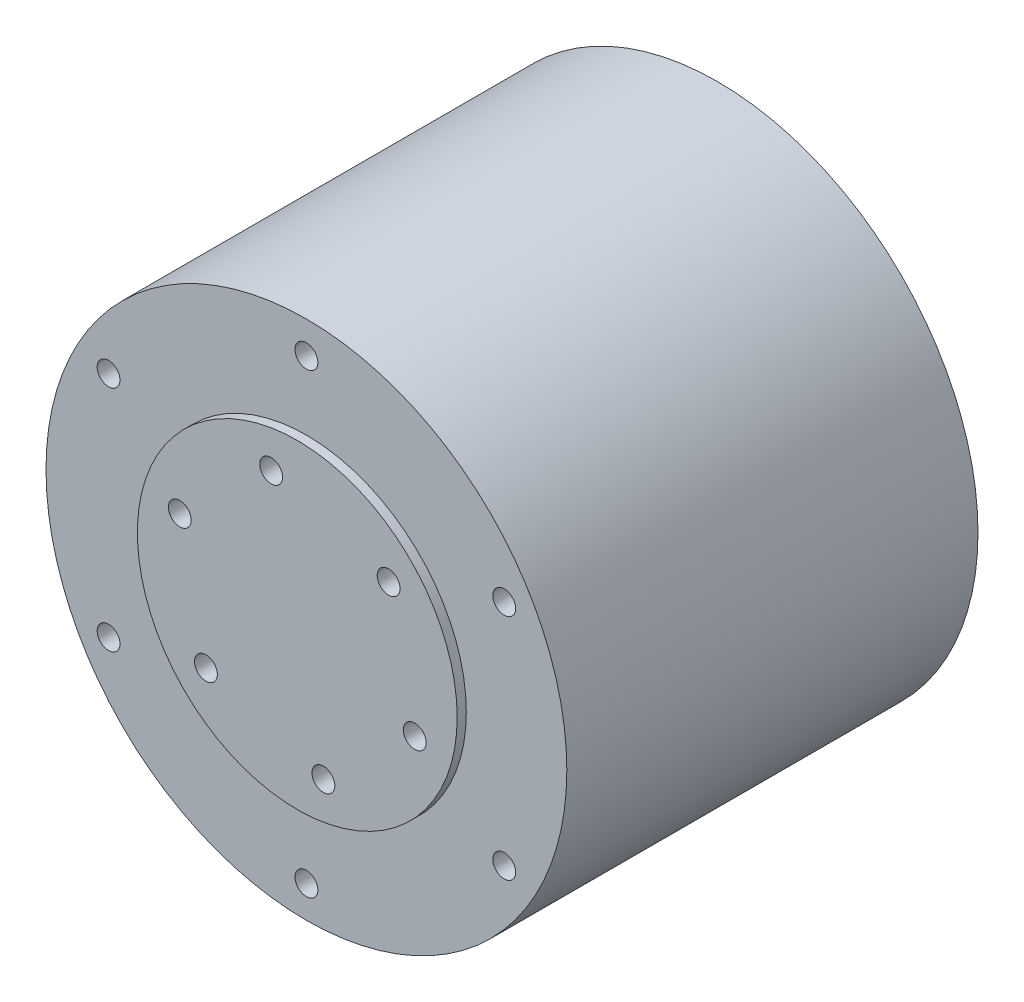
ISO-10303-21;
HEADER;
FILE_DESCRIPTION(('STEP AP214'),'2;1');
FILE_NAME('part.step','',(''),(''),'','','');
FILE_SCHEMA(('AUTOMOTIVE_DESIGN { 1 0 10303 214 1 1 1 1 }'));
ENDSEC;
DATA;
#1=APPLICATION_CONTEXT('core data for automotive mechanical design processes');
#2=APPLICATION_PROTOCOL_DEFINITION('international standard','automotive_design',2000,#1);
#3=PRODUCT_CONTEXT('',#1,'mechanical');
#4=PRODUCT('Part','Part','',(#3));
#5=PRODUCT_RELATED_PRODUCT_CATEGORY('part','',(#4));
#6=PRODUCT_DEFINITION_FORMATION('','',#4);
#7=PRODUCT_DEFINITION_CONTEXT('part definition',#1,'design');
#8=PRODUCT_DEFINITION('design','',#6,#7);
#9=PRODUCT_DEFINITION_SHAPE('','',#8);
#10=(LENGTH_UNIT() NAMED_UNIT(*) SI_UNIT(.MILLI.,.METRE.));
#11=(NAMED_UNIT(*) PLANE_ANGLE_UNIT() SI_UNIT($,.RADIAN.));
#12=(NAMED_UNIT(*) SI_UNIT($,.STERADIAN.) SOLID_ANGLE_UNIT());
#13=UNCERTAINTY_MEASURE_WITH_UNIT(LENGTH_MEASURE(1.E-05),#10,'distance_accuracy_value','');
#14=(GEOMETRIC_REPRESENTATION_CONTEXT(3) GLOBAL_UNCERTAINTY_ASSIGNED_CONTEXT((#13)) GLOBAL_UNIT_ASSIGNED_CONTEXT((#10,
#11,#12)) REPRESENTATION_CONTEXT('',''));
#15=CARTESIAN_POINT('',(0.,0.,0.));
#16=DIRECTION('',(0.,0.,1.));
#17=DIRECTION('',(1.,0.,0.));
#18=AXIS2_PLACEMENT_3D('',#15,#16,#17);
#19=CARTESIAN_POINT('',(0.,0.,45.));
#20=DIRECTION('',(0.,0.,-1.));
#21=DIRECTION('',(-1.,0.,0.));
#22=AXIS2_PLACEMENT_3D('',#19,#20,#21);
#23=CYLINDRICAL_SURFACE('',#22,28.5);
#24=CARTESIAN_POINT('',(0.,0.,45.));
#25=DIRECTION('',(0.,0.,1.));
#26=DIRECTION('',(1.,0.,0.));
#27=AXIS2_PLACEMENT_3D('',#24,#25,#26);
#28=CIRCLE('',#27,28.5);
#29=CARTESIAN_POINT('',(-28.5,0.,45.));
#30=VERTEX_POINT('',#29);
#31=EDGE_CURVE('E53',#30,#30,#28,.T.);
#32=CARTESIAN_POINT('',(0.,0.,0.));
#33=DIRECTION('',(0.,0.,1.));
#34=DIRECTION('',(1.,0.,0.));
#35=AXIS2_PLACEMENT_3D('',#32,#33,#34);
#36=CIRCLE('',#35,28.5);
#37=CARTESIAN_POINT('',(-28.5,0.,0.));
#38=VERTEX_POINT('',#37);
#39=EDGE_CURVE('E48',#38,#38,#36,.T.);
#40=CARTESIAN_POINT('',(-28.5,0.,45.));
#41=CARTESIAN_POINT('',(-28.5,0.,44.53125));
#42=CARTESIAN_POINT('',(-28.5,0.,44.0625));
#43=CARTESIAN_POINT('',(-28.5,0.,43.125));
#44=CARTESIAN_POINT('',(-28.5,0.,42.65625));
#45=CARTESIAN_POINT('',(-28.5,0.,41.71875));
#46=CARTESIAN_POINT('',(-28.5,0.,41.25));
#47=CARTESIAN_POINT('',(-28.5,0.,40.3125));
#48=CARTESIAN_POINT('',(-28.5,0.,39.84375));
#49=CARTESIAN_POINT('',(-28.5,0.,38.90625));
#50=CARTESIAN_POINT('',(-28.5,0.,38.4375));
#51=CARTESIAN_POINT('',(-28.5,0.,37.5));
#52=CARTESIAN_POINT('',(-28.5,0.,37.03125));
#53=CARTESIAN_POINT('',(-28.5,0.,36.09375));
#54=CARTESIAN_POINT('',(-28.5,0.,35.625));
#55=CARTESIAN_POINT('',(-28.5,0.,34.6875));
#56=CARTESIAN_POINT('',(-28.5,0.,34.21875));
#57=CARTESIAN_POINT('',(-28.5,0.,33.28125));
#58=CARTESIAN_POINT('',(-28.5,0.,32.8125));
#59=CARTESIAN_POINT('',(-28.5,0.,31.875));
#60=CARTESIAN_POINT('',(-28.5,0.,31.40625));
#61=CARTESIAN_POINT('',(-28.5,0.,30.46875));
#62=CARTESIAN_POINT('',(-28.5,0.,30.));
#63=CARTESIAN_POINT('',(-28.5,0.,29.0625));
#64=CARTESIAN_POINT('',(-28.5,0.,28.59375));
#65=CARTESIAN_POINT('',(-28.5,0.,27.65625));
#66=CARTESIAN_POINT('',(-28.5,0.,27.1875));
#67=CARTESIAN_POINT('',(-28.5,0.,26.25));
#68=CARTESIAN_POINT('',(-28.5,0.,25.78125));
#69=CARTESIAN_POINT('',(-28.5,0.,24.84375));
#70=CARTESIAN_POINT('',(-28.5,0.,24.375));
#71=CARTESIAN_POINT('',(-28.5,0.,23.4375));
#72=CARTESIAN_POINT('',(-28.5,0.,22.96875));
#73=CARTESIAN_POINT('',(-28.5,0.,22.03125));
#74=CARTESIAN_POINT('',(-28.5,0.,21.5625));
#75=CARTESIAN_POINT('',(-28.5,0.,20.625));
#76=CARTESIAN_POINT('',(-28.5,0.,20.15625));
#77=CARTESIAN_POINT('',(-28.5,0.,19.21875));
#78=CARTESIAN_POINT('',(-28.5,0.,18.75));
#79=CARTESIAN_POINT('',(-28.5,0.,17.8125));
#80=CARTESIAN_POINT('',(-28.5,0.,17.34375));
#81=CARTESIAN_POINT('',(-28.5,0.,16.40625));
#82=CARTESIAN_POINT('',(-28.5,0.,15.9375));
#83=CARTESIAN_POINT('',(-28.5,0.,15.));
#84=CARTESIAN_POINT('',(-28.5,0.,14.53125));
#85=CARTESIAN_POINT('',(-28.5,0.,13.59375));
#86=CARTESIAN_POINT('',(-28.5,0.,13.125));
#87=CARTESIAN_POINT('',(-28.5,0.,12.1875));
#88=CARTESIAN_POINT('',(-28.5,0.,11.71875));
#89=CARTESIAN_POINT('',(-28.5,0.,10.78125));
#90=CARTESIAN_POINT('',(-28.5,0.,10.3125));
#91=CARTESIAN_POINT('',(-28.5,0.,9.375));
#92=CARTESIAN_POINT('',(-28.5,0.,8.90625));
#93=CARTESIAN_POINT('',(-28.5,0.,7.96874999999999));
#94=CARTESIAN_POINT('',(-28.5,0.,7.5));
#95=CARTESIAN_POINT('',(-28.5,0.,6.5625));
#96=CARTESIAN_POINT('',(-28.5,0.,6.09375));
#97=CARTESIAN_POINT('',(-28.5,0.,5.15625));
#98=CARTESIAN_POINT('',(-28.5,0.,4.68749999999999));
#99=CARTESIAN_POINT('',(-28.5,0.,3.74999999999999));
#100=CARTESIAN_POINT('',(-28.5,0.,3.28124999999999));
#101=CARTESIAN_POINT('',(-28.5,0.,2.34374999999999));
#102=CARTESIAN_POINT('',(-28.5,0.,1.87499999999999));
#103=CARTESIAN_POINT('',(-28.5,0.,0.937499999999992));
#104=CARTESIAN_POINT('',(-28.5,0.,0.468749999999993));
#105=CARTESIAN_POINT('',(-28.5,0.,0.));
#106=B_SPLINE_CURVE_WITH_KNOTS('',3,(#40,#41,#42,#43,#44,#45,#46,#47,#48,#49,#50,#51,#52,#53,
#54,#55,#56,#57,#58,#59,#60,#61,#62,#63,#64,#65,#66,#67,#68,#69,#70,#71,#72,#73,#74,#75,#76,#77,
#78,#79,#80,#81,#82,#83,#84,#85,#86,#87,#88,#89,#90,#91,#92,#93,#94,#95,#96,#97,#98,#99,#100,
#101,#102,#103,#104,#105),.UNSPECIFIED.,.F.,.F.,(4,2,2,2,2,2,2,2,2,2,2,2,2,2,2,2,2,2,2,2,2,2,2,
2,2,2,2,2,2,2,2,2,4),(0.,1.40625,2.8125,4.21875000000001,5.62500000000001,7.03125,8.4375,
9.84375000000001,11.25,12.65625,14.0625,15.46875,16.875,18.28125,19.6875,21.09375,22.5,23.90625,
25.3125,26.71875,28.125,29.53125,30.9375,32.34375,33.75,35.15625,36.5625,37.96875,39.375,
40.78125,42.1875,43.59375,45.),.UNSPECIFIED.);
#107=EDGE_CURVE('BSEAM45',#30,#38,#106,.T.);
#108=ORIENTED_EDGE('',*,*,#31,.F.);
#109=ORIENTED_EDGE('',*,*,#39,.T.);
#110=ORIENTED_EDGE('',*,*,#107,.T.);
#111=ORIENTED_EDGE('',*,*,#107,.F.);
#112=EDGE_LOOP('',(#108,#110,#109,#111));
#113=FACE_BOUND('',#112,.T.);
#114=ADVANCED_FACE('F45',(#113),#23,.T.);
#115=CARTESIAN_POINT('',(0.,0.,45.));
#116=DIRECTION('',(0.,0.,1.));
#117=DIRECTION('',(1.,0.,0.));
#118=AXIS2_PLACEMENT_3D('',#115,#116,#117);
#119=PLANE('',#118);
#120=CARTESIAN_POINT('',(0.,25.,45.));
#121=DIRECTION('',(0.,0.,1.));
#122=DIRECTION('',(1.,0.,0.));
#123=AXIS2_PLACEMENT_3D('',#120,#121,#122);
#124=CIRCLE('',#123,1.25);
#125=CARTESIAN_POINT('',(1.25,25.,45.));
#126=VERTEX_POINT('',#125);
#127=EDGE_CURVE('E172',#126,#126,#124,.T.);
#128=ORIENTED_EDGE('',*,*,#127,.F.);
#129=EDGE_LOOP('',(#128));
#130=FACE_BOUND('',#129,.T.);
#131=CARTESIAN_POINT('',(21.650635094611,12.5,45.));
#132=DIRECTION('',(0.,0.,1.));
#133=DIRECTION('',(1.,0.,0.));
#134=AXIS2_PLACEMENT_3D('',#131,#132,#133);
#135=CIRCLE('',#134,1.25);
#136=CARTESIAN_POINT('',(22.900635094611,12.5,45.));
#137=VERTEX_POINT('',#136);
#138=EDGE_CURVE('E178',#137,#137,#135,.T.);
#139=ORIENTED_EDGE('',*,*,#138,.F.);
#140=EDGE_LOOP('',(#139));
#141=FACE_BOUND('',#140,.T.);
#142=CARTESIAN_POINT('',(21.650635094611,-12.5,45.));
#143=DIRECTION('',(0.,0.,1.));
#144=DIRECTION('',(1.,0.,0.));
#145=AXIS2_PLACEMENT_3D('',#142,#143,#144);
#146=CIRCLE('',#145,1.25);
#147=CARTESIAN_POINT('',(22.900635094611,-12.5,45.));
#148=VERTEX_POINT('',#147);
#149=EDGE_CURVE('E184',#148,#148,#146,.T.);
#150=ORIENTED_EDGE('',*,*,#149,.F.);
#151=EDGE_LOOP('',(#150));
#152=FACE_BOUND('',#151,.T.);
#153=CARTESIAN_POINT('',(0.,-25.,45.));
#154=DIRECTION('',(0.,0.,1.));
#155=DIRECTION('',(1.,0.,0.));
#156=AXIS2_PLACEMENT_3D('',#153,#154,#155);
#157=CIRCLE('',#156,1.25);
#158=CARTESIAN_POINT('',(1.25,-25.,45.));
#159=VERTEX_POINT('',#158);
#160=EDGE_CURVE('E190',#159,#159,#157,.T.);
#161=ORIENTED_EDGE('',*,*,#160,.F.);
#162=EDGE_LOOP('',(#161));
#163=FACE_BOUND('',#162,.T.);
#164=CARTESIAN_POINT('',(-21.650635094611,-12.5,45.));
#165=DIRECTION('',(0.,0.,1.));
#166=DIRECTION('',(1.,0.,0.));
#167=AXIS2_PLACEMENT_3D('',#164,#165,#166);
#168=CIRCLE('',#167,1.25);
#169=CARTESIAN_POINT('',(-20.400635094611,-12.5,45.));
#170=VERTEX_POINT('',#169);
#171=EDGE_CURVE('E196',#170,#170,#168,.T.);
#172=ORIENTED_EDGE('',*,*,#171,.F.);
#173=EDGE_LOOP('',(#172));
#174=FACE_BOUND('',#173,.T.);
#175=CARTESIAN_POINT('',(-21.650635094611,12.5,45.));
#176=DIRECTION('',(0.,0.,1.));
#177=DIRECTION('',(1.,0.,0.));
#178=AXIS2_PLACEMENT_3D('',#175,#176,#177);
#179=CIRCLE('',#178,1.25);
#180=CARTESIAN_POINT('',(-20.400635094611,12.5,45.));
#181=VERTEX_POINT('',#180);
#182=EDGE_CURVE('E202',#181,#181,#179,.T.);
#183=ORIENTED_EDGE('',*,*,#182,.F.);
#184=EDGE_LOOP('',(#183));
#185=FACE_BOUND('',#184,.T.);
#186=CARTESIAN_POINT('',(0.,0.,45.));
#187=DIRECTION('',(0.,0.,1.));
#188=DIRECTION('',(1.,0.,0.));
#189=AXIS2_PLACEMENT_3D('',#186,#187,#188);
#190=CIRCLE('',#189,17.5);
#191=CARTESIAN_POINT('',(17.5,0.,45.));
#192=VERTEX_POINT('',#191);
#193=EDGE_CURVE('E11',#192,#192,#190,.T.);
#194=ORIENTED_EDGE('',*,*,#193,.F.);
#195=EDGE_LOOP('',(#194));
#196=FACE_BOUND('',#195,.T.);
#197=ORIENTED_EDGE('',*,*,#31,.T.);
#198=EDGE_LOOP('',(#197));
#199=FACE_BOUND('',#198,.T.);
#200=ADVANCED_FACE('F220',(#130,#141,#152,#163,#174,#185,#196,#199),#119,.T.);
#201=CARTESIAN_POINT('',(0.,0.,0.));
#202=DIRECTION('',(0.,0.,1.));
#203=DIRECTION('',(1.,0.,0.));
#204=AXIS2_PLACEMENT_3D('',#201,#202,#203);
#205=PLANE('',#204);
#206=CARTESIAN_POINT('',(13.4350288425444,13.4350288425444,0.));
#207=DIRECTION('',(0.,0.,-1.));
#208=DIRECTION('',(-1.,0.,0.));
#209=AXIS2_PLACEMENT_3D('',#206,#207,#208);
#210=CIRCLE('',#209,1.24999999999999);
#211=CARTESIAN_POINT('',(12.1850288425444,13.4350288425444,0.));
#212=VERTEX_POINT('',#211);
#213=EDGE_CURVE('E114',#212,#212,#210,.T.);
#214=ORIENTED_EDGE('',*,*,#213,.F.);
#215=EDGE_LOOP('',(#214));
#216=FACE_BOUND('',#215,.T.);
#217=CARTESIAN_POINT('',(13.4350288425443,-13.4350288425442,0.));
#218=DIRECTION('',(0.,0.,-1.));
#219=DIRECTION('',(-1.,0.,0.));
#220=AXIS2_PLACEMENT_3D('',#217,#218,#219);
#221=CIRCLE('',#220,1.24999999999999);
#222=CARTESIAN_POINT('',(12.1850288425444,-13.4350288425442,0.));
#223=VERTEX_POINT('',#222);
#224=EDGE_CURVE('E113',#223,#223,#221,.T.);
#225=ORIENTED_EDGE('',*,*,#224,.F.);
#226=EDGE_LOOP('',(#225));
#227=FACE_BOUND('',#226,.T.);
#228=CARTESIAN_POINT('',(-13.4350288425443,-13.4350288425442,0.));
#229=DIRECTION('',(0.,0.,-1.));
#230=DIRECTION('',(-1.,0.,0.));
#231=AXIS2_PLACEMENT_3D('',#228,#229,#230);
#232=CIRCLE('',#231,1.24999999999999);
#233=CARTESIAN_POINT('',(-14.6850288425443,-13.4350288425442,0.));
#234=VERTEX_POINT('',#233);
#235=EDGE_CURVE('E124',#234,#234,#232,.T.);
#236=ORIENTED_EDGE('',*,*,#235,.F.);
#237=EDGE_LOOP('',(#236));
#238=FACE_BOUND('',#237,.T.);
#239=CARTESIAN_POINT('',(-13.4350288425444,13.4350288425444,0.));
#240=DIRECTION('',(0.,0.,-1.));
#241=DIRECTION('',(-1.,0.,0.));
#242=AXIS2_PLACEMENT_3D('',#239,#240,#241);
#243=CIRCLE('',#242,1.24999999999999);
#244=CARTESIAN_POINT('',(-14.6850288425444,13.4350288425444,0.));
#245=VERTEX_POINT('',#244);
#246=EDGE_CURVE('E130',#245,#245,#243,.T.);
#247=ORIENTED_EDGE('',*,*,#246,.F.);
#248=EDGE_LOOP('',(#247));
#249=FACE_BOUND('',#248,.T.);
#250=ORIENTED_EDGE('',*,*,#39,.F.);
#251=EDGE_LOOP('',(#250));
#252=FACE_BOUND('',#251,.T.);
#253=ADVANCED_FACE('F217',(#216,#227,#238,#249,#252),#205,.F.);
#254=CARTESIAN_POINT('',(0.,0.,46.));
#255=DIRECTION('',(0.,0.,-1.));
#256=DIRECTION('',(-1.,0.,0.));
#257=AXIS2_PLACEMENT_3D('',#254,#255,#256);
#258=CYLINDRICAL_SURFACE('',#257,17.5);
#259=CARTESIAN_POINT('',(0.,0.,46.));
#260=DIRECTION('',(0.,0.,1.));
#261=DIRECTION('',(1.,0.,0.));
#262=AXIS2_PLACEMENT_3D('',#259,#260,#261);
#263=CIRCLE('',#262,17.5);
#264=CARTESIAN_POINT('',(17.5,0.,46.));
#265=VERTEX_POINT('',#264);
#266=EDGE_CURVE('E208',#265,#265,#263,.T.);
#267=ORIENTED_EDGE('',*,*,#266,.F.);
#268=EDGE_LOOP('',(#267));
#269=FACE_BOUND('',#268,.T.);
#270=ORIENTED_EDGE('',*,*,#193,.T.);
#271=EDGE_LOOP('',(#270));
#272=FACE_BOUND('',#271,.T.);
#273=ADVANCED_FACE('F219',(#269,#272),#258,.T.);
#274=CARTESIAN_POINT('',(0.,0.,46.));
#275=DIRECTION('',(0.,0.,1.));
#276=DIRECTION('',(1.,0.,0.));
#277=AXIS2_PLACEMENT_3D('',#274,#275,#276);
#278=PLANE('',#277);
#279=CARTESIAN_POINT('',(-2.85768239704188,13.194076372283,46.));
#280=DIRECTION('',(0.,0.,1.));
#281=DIRECTION('',(1.,0.,0.));
#282=AXIS2_PLACEMENT_3D('',#279,#280,#281);
#283=CIRCLE('',#282,1.24999999999999);
#284=CARTESIAN_POINT('',(-1.60768239704189,13.194076372283,46.));
#285=VERTEX_POINT('',#284);
#286=EDGE_CURVE('E136',#285,#285,#283,.T.);
#287=ORIENTED_EDGE('',*,*,#286,.F.);
#288=EDGE_LOOP('',(#287));
#289=FACE_BOUND('',#288,.T.);
#290=CARTESIAN_POINT('',(9.99756411934819,9.07186373792737,46.));
#291=DIRECTION('',(0.,0.,1.));
#292=DIRECTION('',(1.,0.,0.));
#293=AXIS2_PLACEMENT_3D('',#290,#291,#292);
#294=CIRCLE('',#293,1.24999999999999);
#295=CARTESIAN_POINT('',(11.2475641193482,9.07186373792737,46.));
#296=VERTEX_POINT('',#295);
#297=EDGE_CURVE('E142',#296,#296,#294,.T.);
#298=ORIENTED_EDGE('',*,*,#297,.F.);
#299=EDGE_LOOP('',(#298));
#300=FACE_BOUND('',#299,.T.);
#301=CARTESIAN_POINT('',(12.8552465163901,-4.12221263435564,46.));
#302=DIRECTION('',(0.,0.,1.));
#303=DIRECTION('',(1.,0.,0.));
#304=AXIS2_PLACEMENT_3D('',#301,#302,#303);
#305=CIRCLE('',#304,1.24999999999999);
#306=CARTESIAN_POINT('',(14.10524651639,-4.12221263435564,46.));
#307=VERTEX_POINT('',#306);
#308=EDGE_CURVE('E148',#307,#307,#305,.T.);
#309=ORIENTED_EDGE('',*,*,#308,.F.);
#310=EDGE_LOOP('',(#309));
#311=FACE_BOUND('',#310,.T.);
#312=CARTESIAN_POINT('',(2.85768239704187,-13.194076372283,46.));
#313=DIRECTION('',(0.,0.,1.));
#314=DIRECTION('',(1.,0.,0.));
#315=AXIS2_PLACEMENT_3D('',#312,#313,#314);
#316=CIRCLE('',#315,1.24999999999999);
#317=CARTESIAN_POINT('',(4.10768239704186,-13.194076372283,46.));
#318=VERTEX_POINT('',#317);
#319=EDGE_CURVE('E154',#318,#318,#316,.T.);
#320=ORIENTED_EDGE('',*,*,#319,.F.);
#321=EDGE_LOOP('',(#320));
#322=FACE_BOUND('',#321,.T.);
#323=CARTESIAN_POINT('',(-9.99756411934819,-9.07186373792738,46.));
#324=DIRECTION('',(0.,0.,1.));
#325=DIRECTION('',(1.,0.,0.));
#326=AXIS2_PLACEMENT_3D('',#323,#324,#325);
#327=CIRCLE('',#326,1.24999999999999);
#328=CARTESIAN_POINT('',(-8.7475641193482,-9.07186373792738,46.));
#329=VERTEX_POINT('',#328);
#330=EDGE_CURVE('E160',#329,#329,#327,.T.);
#331=ORIENTED_EDGE('',*,*,#330,.F.);
#332=EDGE_LOOP('',(#331));
#333=FACE_BOUND('',#332,.T.);
#334=CARTESIAN_POINT('',(-12.8552465163901,4.12221263435564,46.));
#335=DIRECTION('',(0.,0.,1.));
#336=DIRECTION('',(1.,0.,0.));
#337=AXIS2_PLACEMENT_3D('',#334,#335,#336);
#338=CIRCLE('',#337,1.24999999999999);
#339=CARTESIAN_POINT('',(-11.6052465163901,4.12221263435564,46.));
#340=VERTEX_POINT('',#339);
#341=EDGE_CURVE('E166',#340,#340,#338,.T.);
#342=ORIENTED_EDGE('',*,*,#341,.F.);
#343=EDGE_LOOP('',(#342));
#344=FACE_BOUND('',#343,.T.);
#345=ORIENTED_EDGE('',*,*,#266,.T.);
#346=EDGE_LOOP('',(#345));
#347=FACE_BOUND('',#346,.T.);
#348=ADVANCED_FACE('F226',(#289,#300,#311,#322,#333,#344,#347),#278,.T.);
#349=CARTESIAN_POINT('',(-21.650635094611,12.5,40.7510757737845));
#350=DIRECTION('',(0.,0.,1.));
#351=DIRECTION('',(1.,0.,0.));
#352=AXIS2_PLACEMENT_3D('',#349,#350,#351);
#353=CONICAL_SURFACE('',#352,1.25,1.02974425867665);
#354=CARTESIAN_POINT('',(-21.650635094611,12.5,40.));
#355=VERTEX_POINT('',#354);
#356=VERTEX_LOOP('',#355);
#357=FACE_BOUND('',#356,.T.);
#358=CARTESIAN_POINT('',(-21.650635094611,12.5,40.7510757737845));
#359=DIRECTION('',(0.,0.,1.));
#360=DIRECTION('',(1.,0.,0.));
#361=AXIS2_PLACEMENT_3D('',#358,#359,#360);
#362=CIRCLE('',#361,1.25);
#363=CARTESIAN_POINT('',(-20.400635094611,12.5,40.7510757737845));
#364=VERTEX_POINT('',#363);
#365=EDGE_CURVE('E205',#364,#364,#362,.T.);
#366=ORIENTED_EDGE('',*,*,#365,.T.);
#367=EDGE_LOOP('',(#366));
#368=FACE_BOUND('',#367,.T.);
#369=ADVANCED_FACE('F262',(#357,#368),#353,.F.);
#370=CARTESIAN_POINT('',(-21.650635094611,12.5,45.));
#371=DIRECTION('',(0.,0.,1.));
#372=DIRECTION('',(1.,0.,0.));
#373=AXIS2_PLACEMENT_3D('',#370,#371,#372);
#374=CYLINDRICAL_SURFACE('',#373,1.25);
#375=ORIENTED_EDGE('',*,*,#365,.F.);
#376=EDGE_LOOP('',(#375));
#377=FACE_BOUND('',#376,.T.);
#378=ORIENTED_EDGE('',*,*,#182,.T.);
#379=EDGE_LOOP('',(#378));
#380=FACE_BOUND('',#379,.T.);
#381=ADVANCED_FACE('F484',(#377,#380),#374,.F.);
#382=CARTESIAN_POINT('',(-21.650635094611,-12.5,40.7510757737845));
#383=DIRECTION('',(0.,0.,1.));
#384=DIRECTION('',(1.,0.,0.));
#385=AXIS2_PLACEMENT_3D('',#382,#383,#384);
#386=CONICAL_SURFACE('',#385,1.25,1.02974425867665);
#387=CARTESIAN_POINT('',(-21.650635094611,-12.5,40.));
#388=VERTEX_POINT('',#387);
#389=VERTEX_LOOP('',#388);
#390=FACE_BOUND('',#389,.T.);
#391=CARTESIAN_POINT('',(-21.650635094611,-12.5,40.7510757737845));
#392=DIRECTION('',(0.,0.,1.));
#393=DIRECTION('',(1.,0.,0.));
#394=AXIS2_PLACEMENT_3D('',#391,#392,#393);
#395=CIRCLE('',#394,1.25);
#396=CARTESIAN_POINT('',(-20.400635094611,-12.5,40.7510757737845));
#397=VERTEX_POINT('',#396);
#398=EDGE_CURVE('E199',#397,#397,#395,.T.);
#399=ORIENTED_EDGE('',*,*,#398,.T.);
#400=EDGE_LOOP('',(#399));
#401=FACE_BOUND('',#400,.T.);
#402=ADVANCED_FACE('F480',(#390,#401),#386,.F.);
#403=CARTESIAN_POINT('',(-21.650635094611,-12.5,45.));
#404=DIRECTION('',(0.,0.,1.));
#405=DIRECTION('',(1.,0.,0.));
#406=AXIS2_PLACEMENT_3D('',#403,#404,#405);
#407=CYLINDRICAL_SURFACE('',#406,1.25);
#408=ORIENTED_EDGE('',*,*,#398,.F.);
#409=EDGE_LOOP('',(#408));
#410=FACE_BOUND('',#409,.T.);
#411=ORIENTED_EDGE('',*,*,#171,.T.);
#412=EDGE_LOOP('',(#411));
#413=FACE_BOUND('',#412,.T.);
#414=ADVANCED_FACE('F476',(#410,#413),#407,.F.);
#415=CARTESIAN_POINT('',(0.,-25.,40.7510757737845));
#416=DIRECTION('',(0.,0.,1.));
#417=DIRECTION('',(1.,0.,0.));
#418=AXIS2_PLACEMENT_3D('',#415,#416,#417);
#419=CONICAL_SURFACE('',#418,1.25,1.02974425867665);
#420=CARTESIAN_POINT('',(0.,-25.,40.));
#421=VERTEX_POINT('',#420);
#422=VERTEX_LOOP('',#421);
#423=FACE_BOUND('',#422,.T.);
#424=CARTESIAN_POINT('',(0.,-25.,40.7510757737845));
#425=DIRECTION('',(0.,0.,1.));
#426=DIRECTION('',(1.,0.,0.));
#427=AXIS2_PLACEMENT_3D('',#424,#425,#426);
#428=CIRCLE('',#427,1.25);
#429=CARTESIAN_POINT('',(1.25,-25.,40.7510757737845));
#430=VERTEX_POINT('',#429);
#431=EDGE_CURVE('E193',#430,#430,#428,.T.);
#432=ORIENTED_EDGE('',*,*,#431,.T.);
#433=EDGE_LOOP('',(#432));
#434=FACE_BOUND('',#433,.T.);
#435=ADVANCED_FACE('F472',(#423,#434),#419,.F.);
#436=CARTESIAN_POINT('',(0.,-25.,45.));
#437=DIRECTION('',(0.,0.,1.));
#438=DIRECTION('',(1.,0.,0.));
#439=AXIS2_PLACEMENT_3D('',#436,#437,#438);
#440=CYLINDRICAL_SURFACE('',#439,1.25);
#441=ORIENTED_EDGE('',*,*,#431,.F.);
#442=EDGE_LOOP('',(#441));
#443=FACE_BOUND('',#442,.T.);
#444=ORIENTED_EDGE('',*,*,#160,.T.);
#445=EDGE_LOOP('',(#444));
#446=FACE_BOUND('',#445,.T.);
#447=ADVANCED_FACE('F468',(#443,#446),#440,.F.);
#448=CARTESIAN_POINT('',(21.650635094611,-12.5,40.7510757737845));
#449=DIRECTION('',(0.,0.,1.));
#450=DIRECTION('',(1.,0.,0.));
#451=AXIS2_PLACEMENT_3D('',#448,#449,#450);
#452=CONICAL_SURFACE('',#451,1.25,1.02974425867665);
#453=CARTESIAN_POINT('',(21.650635094611,-12.5,40.));
#454=VERTEX_POINT('',#453);
#455=VERTEX_LOOP('',#454);
#456=FACE_BOUND('',#455,.T.);
#457=CARTESIAN_POINT('',(21.650635094611,-12.5,40.7510757737845));
#458=DIRECTION('',(0.,0.,1.));
#459=DIRECTION('',(1.,0.,0.));
#460=AXIS2_PLACEMENT_3D('',#457,#458,#459);
#461=CIRCLE('',#460,1.25);
#462=CARTESIAN_POINT('',(22.900635094611,-12.5,40.7510757737845));
#463=VERTEX_POINT('',#462);
#464=EDGE_CURVE('E187',#463,#463,#461,.T.);
#465=ORIENTED_EDGE('',*,*,#464,.T.);
#466=EDGE_LOOP('',(#465));
#467=FACE_BOUND('',#466,.T.);
#468=ADVANCED_FACE('F464',(#456,#467),#452,.F.);
#469=CARTESIAN_POINT('',(21.650635094611,-12.5,45.));
#470=DIRECTION('',(0.,0.,1.));
#471=DIRECTION('',(1.,0.,0.));
#472=AXIS2_PLACEMENT_3D('',#469,#470,#471);
#473=CYLINDRICAL_SURFACE('',#472,1.25);
#474=ORIENTED_EDGE('',*,*,#464,.F.);
#475=EDGE_LOOP('',(#474));
#476=FACE_BOUND('',#475,.T.);
#477=ORIENTED_EDGE('',*,*,#149,.T.);
#478=EDGE_LOOP('',(#477));
#479=FACE_BOUND('',#478,.T.);
#480=ADVANCED_FACE('F460',(#476,#479),#473,.F.);
#481=CARTESIAN_POINT('',(21.650635094611,12.5,40.7510757737845));
#482=DIRECTION('',(0.,0.,1.));
#483=DIRECTION('',(1.,0.,0.));
#484=AXIS2_PLACEMENT_3D('',#481,#482,#483);
#485=CONICAL_SURFACE('',#484,1.25,1.02974425867665);
#486=CARTESIAN_POINT('',(21.650635094611,12.5,40.));
#487=VERTEX_POINT('',#486);
#488=VERTEX_LOOP('',#487);
#489=FACE_BOUND('',#488,.T.);
#490=CARTESIAN_POINT('',(21.650635094611,12.5,40.7510757737845));
#491=DIRECTION('',(0.,0.,1.));
#492=DIRECTION('',(1.,0.,0.));
#493=AXIS2_PLACEMENT_3D('',#490,#491,#492);
#494=CIRCLE('',#493,1.25);
#495=CARTESIAN_POINT('',(22.900635094611,12.5,40.7510757737845));
#496=VERTEX_POINT('',#495);
#497=EDGE_CURVE('E181',#496,#496,#494,.T.);
#498=ORIENTED_EDGE('',*,*,#497,.T.);
#499=EDGE_LOOP('',(#498));
#500=FACE_BOUND('',#499,.T.);
#501=ADVANCED_FACE('F456',(#489,#500),#485,.F.);
#502=CARTESIAN_POINT('',(21.650635094611,12.5,45.));
#503=DIRECTION('',(0.,0.,1.));
#504=DIRECTION('',(1.,0.,0.));
#505=AXIS2_PLACEMENT_3D('',#502,#503,#504);
#506=CYLINDRICAL_SURFACE('',#505,1.25);
#507=ORIENTED_EDGE('',*,*,#497,.F.);
#508=EDGE_LOOP('',(#507));
#509=FACE_BOUND('',#508,.T.);
#510=ORIENTED_EDGE('',*,*,#138,.T.);
#511=EDGE_LOOP('',(#510));
#512=FACE_BOUND('',#511,.T.);
#513=ADVANCED_FACE('F452',(#509,#512),#506,.F.);
#514=CARTESIAN_POINT('',(0.,25.,40.7510757737845));
#515=DIRECTION('',(0.,0.,1.));
#516=DIRECTION('',(1.,0.,0.));
#517=AXIS2_PLACEMENT_3D('',#514,#515,#516);
#518=CONICAL_SURFACE('',#517,1.25,1.02974425867665);
#519=CARTESIAN_POINT('',(0.,25.,40.));
#520=VERTEX_POINT('',#519);
#521=VERTEX_LOOP('',#520);
#522=FACE_BOUND('',#521,.T.);
#523=CARTESIAN_POINT('',(0.,25.,40.7510757737845));
#524=DIRECTION('',(0.,0.,1.));
#525=DIRECTION('',(1.,0.,0.));
#526=AXIS2_PLACEMENT_3D('',#523,#524,#525);
#527=CIRCLE('',#526,1.25);
#528=CARTESIAN_POINT('',(1.25,25.,40.7510757737845));
#529=VERTEX_POINT('',#528);
#530=EDGE_CURVE('E175',#529,#529,#527,.T.);
#531=ORIENTED_EDGE('',*,*,#530,.T.);
#532=EDGE_LOOP('',(#531));
#533=FACE_BOUND('',#532,.T.);
#534=ADVANCED_FACE('F449',(#522,#533),#518,.F.);
#535=CARTESIAN_POINT('',(0.,25.,45.));
#536=DIRECTION('',(0.,0.,1.));
#537=DIRECTION('',(1.,0.,0.));
#538=AXIS2_PLACEMENT_3D('',#535,#536,#537);
#539=CYLINDRICAL_SURFACE('',#538,1.25);
#540=ORIENTED_EDGE('',*,*,#530,.F.);
#541=EDGE_LOOP('',(#540));
#542=FACE_BOUND('',#541,.T.);
#543=ORIENTED_EDGE('',*,*,#127,.T.);
#544=EDGE_LOOP('',(#543));
#545=FACE_BOUND('',#544,.T.);
#546=ADVANCED_FACE('F273',(#542,#545),#539,.F.);
#547=CARTESIAN_POINT('',(-12.8552465163901,4.12221263435564,41.7510757737845));
#548=DIRECTION('',(0.,0.,1.));
#549=DIRECTION('',(1.,0.,0.));
#550=AXIS2_PLACEMENT_3D('',#547,#548,#549);
#551=CONICAL_SURFACE('',#550,1.25,1.02974425867665);
#552=CARTESIAN_POINT('',(-12.8552465163901,4.12221263435564,41.));
#553=VERTEX_POINT('',#552);
#554=VERTEX_LOOP('',#553);
#555=FACE_BOUND('',#554,.T.);
#556=CARTESIAN_POINT('',(-12.8552465163901,4.12221263435564,41.7510757737845));
#557=DIRECTION('',(0.,0.,1.));
#558=DIRECTION('',(1.,0.,0.));
#559=AXIS2_PLACEMENT_3D('',#556,#557,#558);
#560=CIRCLE('',#559,1.25);
#561=CARTESIAN_POINT('',(-11.6052465163901,4.12221263435564,41.7510757737845));
#562=VERTEX_POINT('',#561);
#563=EDGE_CURVE('E169',#562,#562,#560,.T.);
#564=ORIENTED_EDGE('',*,*,#563,.T.);
#565=EDGE_LOOP('',(#564));
#566=FACE_BOUND('',#565,.T.);
#567=ADVANCED_FACE('F278',(#555,#566),#551,.F.);
#568=CARTESIAN_POINT('',(-12.8552465163901,4.12221263435564,46.));
#569=DIRECTION('',(0.,0.,1.));
#570=DIRECTION('',(1.,0.,0.));
#571=AXIS2_PLACEMENT_3D('',#568,#569,#570);
#572=CYLINDRICAL_SURFACE('',#571,1.24999999999999);
#573=ORIENTED_EDGE('',*,*,#563,.F.);
#574=EDGE_LOOP('',(#573));
#575=FACE_BOUND('',#574,.T.);
#576=ORIENTED_EDGE('',*,*,#341,.T.);
#577=EDGE_LOOP('',(#576));
#578=FACE_BOUND('',#577,.T.);
#579=ADVANCED_FACE('F282',(#575,#578),#572,.F.);
#580=CARTESIAN_POINT('',(-9.99756411934819,-9.07186373792738,41.7510757737845));
#581=DIRECTION('',(0.,0.,1.));
#582=DIRECTION('',(1.,0.,0.));
#583=AXIS2_PLACEMENT_3D('',#580,#581,#582);
#584=CONICAL_SURFACE('',#583,1.25,1.02974425867665);
#585=CARTESIAN_POINT('',(-9.99756411934819,-9.07186373792738,41.));
#586=VERTEX_POINT('',#585);
#587=VERTEX_LOOP('',#586);
#588=FACE_BOUND('',#587,.T.);
#589=CARTESIAN_POINT('',(-9.99756411934819,-9.07186373792738,41.7510757737845));
#590=DIRECTION('',(0.,0.,1.));
#591=DIRECTION('',(1.,0.,0.));
#592=AXIS2_PLACEMENT_3D('',#589,#590,#591);
#593=CIRCLE('',#592,1.25);
#594=CARTESIAN_POINT('',(-8.74756411934819,-9.07186373792738,41.7510757737845));
#595=VERTEX_POINT('',#594);
#596=EDGE_CURVE('E163',#595,#595,#593,.T.);
#597=ORIENTED_EDGE('',*,*,#596,.T.);
#598=EDGE_LOOP('',(#597));
#599=FACE_BOUND('',#598,.T.);
#600=ADVANCED_FACE('F291',(#588,#599),#584,.F.);
#601=CARTESIAN_POINT('',(-9.99756411934819,-9.07186373792738,46.));
#602=DIRECTION('',(0.,0.,1.));
#603=DIRECTION('',(1.,0.,0.));
#604=AXIS2_PLACEMENT_3D('',#601,#602,#603);
#605=CYLINDRICAL_SURFACE('',#604,1.24999999999999);
#606=ORIENTED_EDGE('',*,*,#596,.F.);
#607=EDGE_LOOP('',(#606));
#608=FACE_BOUND('',#607,.T.);
#609=ORIENTED_EDGE('',*,*,#330,.T.);
#610=EDGE_LOOP('',(#609));
#611=FACE_BOUND('',#610,.T.);
#612=ADVANCED_FACE('F301',(#608,#611),#605,.F.);
#613=CARTESIAN_POINT('',(2.85768239704187,-13.194076372283,41.7510757737845));
#614=DIRECTION('',(0.,0.,1.));
#615=DIRECTION('',(1.,0.,0.));
#616=AXIS2_PLACEMENT_3D('',#613,#614,#615);
#617=CONICAL_SURFACE('',#616,1.25,1.02974425867665);
#618=CARTESIAN_POINT('',(2.85768239704187,-13.194076372283,41.));
#619=VERTEX_POINT('',#618);
#620=VERTEX_LOOP('',#619);
#621=FACE_BOUND('',#620,.T.);
#622=CARTESIAN_POINT('',(2.85768239704187,-13.194076372283,41.7510757737845));
#623=DIRECTION('',(0.,0.,1.));
#624=DIRECTION('',(1.,0.,0.));
#625=AXIS2_PLACEMENT_3D('',#622,#623,#624);
#626=CIRCLE('',#625,1.25);
#627=CARTESIAN_POINT('',(4.10768239704187,-13.194076372283,41.7510757737845));
#628=VERTEX_POINT('',#627);
#629=EDGE_CURVE('E157',#628,#628,#626,.T.);
#630=ORIENTED_EDGE('',*,*,#629,.T.);
#631=EDGE_LOOP('',(#630));
#632=FACE_BOUND('',#631,.T.);
#633=ADVANCED_FACE('F309',(#621,#632),#617,.F.);
#634=CARTESIAN_POINT('',(2.85768239704187,-13.194076372283,46.));
#635=DIRECTION('',(0.,0.,1.));
#636=DIRECTION('',(1.,0.,0.));
#637=AXIS2_PLACEMENT_3D('',#634,#635,#636);
#638=CYLINDRICAL_SURFACE('',#637,1.24999999999999);
#639=ORIENTED_EDGE('',*,*,#629,.F.);
#640=EDGE_LOOP('',(#639));
#641=FACE_BOUND('',#640,.T.);
#642=ORIENTED_EDGE('',*,*,#319,.T.);
#643=EDGE_LOOP('',(#642));
#644=FACE_BOUND('',#643,.T.);
#645=ADVANCED_FACE('F319',(#641,#644),#638,.F.);
#646=CARTESIAN_POINT('',(12.8552465163901,-4.12221263435564,41.7510757737845));
#647=DIRECTION('',(0.,0.,1.));
#648=DIRECTION('',(1.,0.,0.));
#649=AXIS2_PLACEMENT_3D('',#646,#647,#648);
#650=CONICAL_SURFACE('',#649,1.25,1.02974425867665);
#651=CARTESIAN_POINT('',(12.8552465163901,-4.12221263435564,41.));
#652=VERTEX_POINT('',#651);
#653=VERTEX_LOOP('',#652);
#654=FACE_BOUND('',#653,.T.);
#655=CARTESIAN_POINT('',(12.8552465163901,-4.12221263435564,41.7510757737845));
#656=DIRECTION('',(0.,0.,1.));
#657=DIRECTION('',(1.,0.,0.));
#658=AXIS2_PLACEMENT_3D('',#655,#656,#657);
#659=CIRCLE('',#658,1.25);
#660=CARTESIAN_POINT('',(14.1052465163901,-4.12221263435564,41.7510757737845));
#661=VERTEX_POINT('',#660);
#662=EDGE_CURVE('E151',#661,#661,#659,.T.);
#663=ORIENTED_EDGE('',*,*,#662,.T.);
#664=EDGE_LOOP('',(#663));
#665=FACE_BOUND('',#664,.T.);
#666=ADVANCED_FACE('F327',(#654,#665),#650,.F.);
#667=CARTESIAN_POINT('',(12.8552465163901,-4.12221263435564,46.));
#668=DIRECTION('',(0.,0.,1.));
#669=DIRECTION('',(1.,0.,0.));
#670=AXIS2_PLACEMENT_3D('',#667,#668,#669);
#671=CYLINDRICAL_SURFACE('',#670,1.24999999999999);
#672=ORIENTED_EDGE('',*,*,#662,.F.);
#673=EDGE_LOOP('',(#672));
#674=FACE_BOUND('',#673,.T.);
#675=ORIENTED_EDGE('',*,*,#308,.T.);
#676=EDGE_LOOP('',(#675));
#677=FACE_BOUND('',#676,.T.);
#678=ADVANCED_FACE('F337',(#674,#677),#671,.F.);
#679=CARTESIAN_POINT('',(9.99756411934819,9.07186373792737,41.7510757737845));
#680=DIRECTION('',(0.,0.,1.));
#681=DIRECTION('',(1.,0.,0.));
#682=AXIS2_PLACEMENT_3D('',#679,#680,#681);
#683=CONICAL_SURFACE('',#682,1.25,1.02974425867665);
#684=CARTESIAN_POINT('',(9.99756411934819,9.07186373792737,41.));
#685=VERTEX_POINT('',#684);
#686=VERTEX_LOOP('',#685);
#687=FACE_BOUND('',#686,.T.);
#688=CARTESIAN_POINT('',(9.99756411934819,9.07186373792737,41.7510757737845));
#689=DIRECTION('',(0.,0.,1.));
#690=DIRECTION('',(1.,0.,0.));
#691=AXIS2_PLACEMENT_3D('',#688,#689,#690);
#692=CIRCLE('',#691,1.25);
#693=CARTESIAN_POINT('',(11.2475641193482,9.07186373792737,41.7510757737845));
#694=VERTEX_POINT('',#693);
#695=EDGE_CURVE('E145',#694,#694,#692,.T.);
#696=ORIENTED_EDGE('',*,*,#695,.T.);
#697=EDGE_LOOP('',(#696));
#698=FACE_BOUND('',#697,.T.);
#699=ADVANCED_FACE('F345',(#687,#698),#683,.F.);
#700=CARTESIAN_POINT('',(9.99756411934819,9.07186373792737,46.));
#701=DIRECTION('',(0.,0.,1.));
#702=DIRECTION('',(1.,0.,0.));
#703=AXIS2_PLACEMENT_3D('',#700,#701,#702);
#704=CYLINDRICAL_SURFACE('',#703,1.24999999999999);
#705=ORIENTED_EDGE('',*,*,#695,.F.);
#706=EDGE_LOOP('',(#705));
#707=FACE_BOUND('',#706,.T.);
#708=ORIENTED_EDGE('',*,*,#297,.T.);
#709=EDGE_LOOP('',(#708));
#710=FACE_BOUND('',#709,.T.);
#711=ADVANCED_FACE('F355',(#707,#710),#704,.F.);
#712=CARTESIAN_POINT('',(-2.85768239704188,13.194076372283,41.7510757737845));
#713=DIRECTION('',(0.,0.,1.));
#714=DIRECTION('',(1.,0.,0.));
#715=AXIS2_PLACEMENT_3D('',#712,#713,#714);
#716=CONICAL_SURFACE('',#715,1.25,1.02974425867665);
#717=CARTESIAN_POINT('',(-2.85768239704188,13.194076372283,41.));
#718=VERTEX_POINT('',#717);
#719=VERTEX_LOOP('',#718);
#720=FACE_BOUND('',#719,.T.);
#721=CARTESIAN_POINT('',(-2.85768239704188,13.194076372283,41.7510757737845));
#722=DIRECTION('',(0.,0.,1.));
#723=DIRECTION('',(1.,0.,0.));
#724=AXIS2_PLACEMENT_3D('',#721,#722,#723);
#725=CIRCLE('',#724,1.25);
#726=CARTESIAN_POINT('',(-1.60768239704188,13.194076372283,41.7510757737845));
#727=VERTEX_POINT('',#726);
#728=EDGE_CURVE('E139',#727,#727,#725,.T.);
#729=ORIENTED_EDGE('',*,*,#728,.T.);
#730=EDGE_LOOP('',(#729));
#731=FACE_BOUND('',#730,.T.);
#732=ADVANCED_FACE('F363',(#720,#731),#716,.F.);
#733=CARTESIAN_POINT('',(-2.85768239704188,13.194076372283,46.));
#734=DIRECTION('',(0.,0.,1.));
#735=DIRECTION('',(1.,0.,0.));
#736=AXIS2_PLACEMENT_3D('',#733,#734,#735);
#737=CYLINDRICAL_SURFACE('',#736,1.24999999999999);
#738=ORIENTED_EDGE('',*,*,#728,.F.);
#739=EDGE_LOOP('',(#738));
#740=FACE_BOUND('',#739,.T.);
#741=ORIENTED_EDGE('',*,*,#286,.T.);
#742=EDGE_LOOP('',(#741));
#743=FACE_BOUND('',#742,.T.);
#744=ADVANCED_FACE('F372',(#740,#743),#737,.F.);
#745=CARTESIAN_POINT('',(-13.4350288425444,13.4350288425444,4.24892422621555));
#746=DIRECTION('',(0.,0.,-1.));
#747=DIRECTION('',(-1.,0.,0.));
#748=AXIS2_PLACEMENT_3D('',#745,#746,#747);
#749=CONICAL_SURFACE('',#748,1.25,1.02974425867665);
#750=CARTESIAN_POINT('',(-13.4350288425444,13.4350288425444,5.));
#751=VERTEX_POINT('',#750);
#752=VERTEX_LOOP('',#751);
#753=FACE_BOUND('',#752,.T.);
#754=CARTESIAN_POINT('',(-13.4350288425444,13.4350288425444,4.24892422621555));
#755=DIRECTION('',(0.,0.,-1.));
#756=DIRECTION('',(-1.,0.,0.));
#757=AXIS2_PLACEMENT_3D('',#754,#755,#756);
#758=CIRCLE('',#757,1.25);
#759=CARTESIAN_POINT('',(-14.6850288425444,13.4350288425444,4.24892422621555));
#760=VERTEX_POINT('',#759);
#761=EDGE_CURVE('E133',#760,#760,#758,.T.);
#762=ORIENTED_EDGE('',*,*,#761,.T.);
#763=EDGE_LOOP('',(#762));
#764=FACE_BOUND('',#763,.T.);
#765=ADVANCED_FACE('F379',(#753,#764),#749,.F.);
#766=CARTESIAN_POINT('',(-13.4350288425444,13.4350288425444,0.));
#767=DIRECTION('',(0.,0.,-1.));
#768=DIRECTION('',(-1.,0.,0.));
#769=AXIS2_PLACEMENT_3D('',#766,#767,#768);
#770=CYLINDRICAL_SURFACE('',#769,1.24999999999999);
#771=ORIENTED_EDGE('',*,*,#761,.F.);
#772=EDGE_LOOP('',(#771));
#773=FACE_BOUND('',#772,.T.);
#774=ORIENTED_EDGE('',*,*,#246,.T.);
#775=EDGE_LOOP('',(#774));
#776=FACE_BOUND('',#775,.T.);
#777=ADVANCED_FACE('F412',(#773,#776),#770,.F.);
#778=CARTESIAN_POINT('',(-13.4350288425443,-13.4350288425442,4.24892422621555));
#779=DIRECTION('',(0.,0.,-1.));
#780=DIRECTION('',(-1.,0.,0.));
#781=AXIS2_PLACEMENT_3D('',#778,#779,#780);
#782=CONICAL_SURFACE('',#781,1.25,1.02974425867665);
#783=CARTESIAN_POINT('',(-13.4350288425443,-13.4350288425442,5.));
#784=VERTEX_POINT('',#783);
#785=VERTEX_LOOP('',#784);
#786=FACE_BOUND('',#785,.T.);
#787=CARTESIAN_POINT('',(-13.4350288425443,-13.4350288425442,4.24892422621555));
#788=DIRECTION('',(0.,0.,-1.));
#789=DIRECTION('',(-1.,0.,0.));
#790=AXIS2_PLACEMENT_3D('',#787,#788,#789);
#791=CIRCLE('',#790,1.25);
#792=CARTESIAN_POINT('',(-14.6850288425443,-13.4350288425442,4.24892422621555));
#793=VERTEX_POINT('',#792);
#794=EDGE_CURVE('E127',#793,#793,#791,.T.);
#795=ORIENTED_EDGE('',*,*,#794,.T.);
#796=EDGE_LOOP('',(#795));
#797=FACE_BOUND('',#796,.T.);
#798=ADVANCED_FACE('F406',(#786,#797),#782,.F.);
#799=CARTESIAN_POINT('',(-13.4350288425443,-13.4350288425442,0.));
#800=DIRECTION('',(0.,0.,-1.));
#801=DIRECTION('',(-1.,0.,0.));
#802=AXIS2_PLACEMENT_3D('',#799,#800,#801);
#803=CYLINDRICAL_SURFACE('',#802,1.24999999999999);
#804=ORIENTED_EDGE('',*,*,#794,.F.);
#805=EDGE_LOOP('',(#804));
#806=FACE_BOUND('',#805,.T.);
#807=ORIENTED_EDGE('',*,*,#235,.T.);
#808=EDGE_LOOP('',(#807));
#809=FACE_BOUND('',#808,.T.);
#810=ADVANCED_FACE('F402',(#806,#809),#803,.F.);
#811=CARTESIAN_POINT('',(13.4350288425443,-13.4350288425442,4.24892422621555));
#812=DIRECTION('',(0.,0.,-1.));
#813=DIRECTION('',(-1.,0.,0.));
#814=AXIS2_PLACEMENT_3D('',#811,#812,#813);
#815=CONICAL_SURFACE('',#814,1.25,1.02974425867665);
#816=CARTESIAN_POINT('',(13.4350288425443,-13.4350288425442,5.));
#817=VERTEX_POINT('',#816);
#818=VERTEX_LOOP('',#817);
#819=FACE_BOUND('',#818,.T.);
#820=CARTESIAN_POINT('',(13.4350288425443,-13.4350288425442,4.24892422621555));
#821=DIRECTION('',(0.,0.,-1.));
#822=DIRECTION('',(-1.,0.,0.));
#823=AXIS2_PLACEMENT_3D('',#820,#821,#822);
#824=CIRCLE('',#823,1.25);
#825=CARTESIAN_POINT('',(12.1850288425443,-13.4350288425442,4.24892422621555));
#826=VERTEX_POINT('',#825);
#827=EDGE_CURVE('E117',#826,#826,#824,.T.);
#828=ORIENTED_EDGE('',*,*,#827,.T.);
#829=EDGE_LOOP('',(#828));
#830=FACE_BOUND('',#829,.T.);
#831=ADVANCED_FACE('F396',(#819,#830),#815,.F.);
#832=CARTESIAN_POINT('',(13.4350288425443,-13.4350288425442,0.));
#833=DIRECTION('',(0.,0.,-1.));
#834=DIRECTION('',(-1.,0.,0.));
#835=AXIS2_PLACEMENT_3D('',#832,#833,#834);
#836=CYLINDRICAL_SURFACE('',#835,1.24999999999999);
#837=ORIENTED_EDGE('',*,*,#827,.F.);
#838=EDGE_LOOP('',(#837));
#839=FACE_BOUND('',#838,.T.);
#840=ORIENTED_EDGE('',*,*,#224,.T.);
#841=EDGE_LOOP('',(#840));
#842=FACE_BOUND('',#841,.T.);
#843=ADVANCED_FACE('F107',(#839,#842),#836,.F.);
#844=CARTESIAN_POINT('',(13.4350288425444,13.4350288425444,4.24892422621555));
#845=DIRECTION('',(0.,0.,-1.));
#846=DIRECTION('',(-1.,0.,0.));
#847=AXIS2_PLACEMENT_3D('',#844,#845,#846);
#848=CONICAL_SURFACE('',#847,1.25,1.02974425867665);
#849=CARTESIAN_POINT('',(13.4350288425444,13.4350288425444,5.));
#850=VERTEX_POINT('',#849);
#851=VERTEX_LOOP('',#850);
#852=FACE_BOUND('',#851,.T.);
#853=CARTESIAN_POINT('',(13.4350288425444,13.4350288425444,4.24892422621555));
#854=DIRECTION('',(0.,0.,-1.));
#855=DIRECTION('',(-1.,0.,0.));
#856=AXIS2_PLACEMENT_3D('',#853,#854,#855);
#857=CIRCLE('',#856,1.25);
#858=CARTESIAN_POINT('',(12.1850288425444,13.4350288425444,4.24892422621555));
#859=VERTEX_POINT('',#858);
#860=EDGE_CURVE('E111',#859,#859,#857,.T.);
#861=ORIENTED_EDGE('',*,*,#860,.T.);
#862=EDGE_LOOP('',(#861));
#863=FACE_BOUND('',#862,.T.);
#864=ADVANCED_FACE('F103',(#852,#863),#848,.F.);
#865=CARTESIAN_POINT('',(13.4350288425444,13.4350288425444,0.));
#866=DIRECTION('',(0.,0.,-1.));
#867=DIRECTION('',(-1.,0.,0.));
#868=AXIS2_PLACEMENT_3D('',#865,#866,#867);
#869=CYLINDRICAL_SURFACE('',#868,1.24999999999999);
#870=ORIENTED_EDGE('',*,*,#860,.F.);
#871=EDGE_LOOP('',(#870));
#872=FACE_BOUND('',#871,.T.);
#873=ORIENTED_EDGE('',*,*,#213,.T.);
#874=EDGE_LOOP('',(#873));
#875=FACE_BOUND('',#874,.T.);
#876=ADVANCED_FACE('F106',(#872,#875),#869,.F.);
#877=CLOSED_SHELL('',(#114,#200,#253,#273,#348,#369,#381,#402,#414,#435,#447,#468,#480,#501,
#513,#534,#546,#567,#579,#600,#612,#633,#645,#666,#678,#699,#711,#732,#744,#765,#777,#798,#810,
#831,#843,#864,#876));
#878=MANIFOLD_SOLID_BREP('B2',#877);
#879=ADVANCED_BREP_SHAPE_REPRESENTATION('',(#18,#878),#14);
#880=SHAPE_DEFINITION_REPRESENTATION(#9,#879);
ENDSEC;
END-ISO-10303-21;
